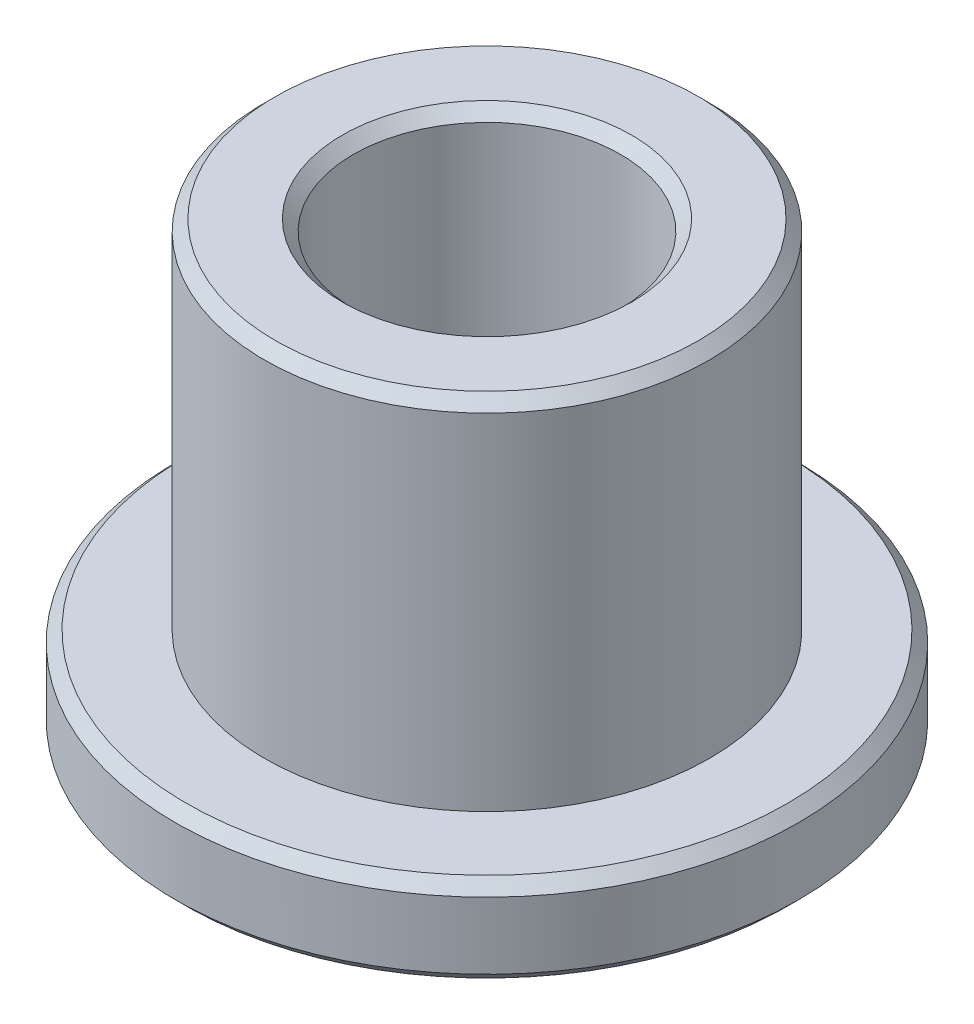
ISO-10303-21;
HEADER;
FILE_DESCRIPTION(('STEP AP214'),'2;1');
FILE_NAME('part.step','',(''),(''),'','','');
FILE_SCHEMA(('AUTOMOTIVE_DESIGN { 1 0 10303 214 1 1 1 1 }'));
ENDSEC;
DATA;
#1=APPLICATION_CONTEXT('core data for automotive mechanical design processes');
#2=APPLICATION_PROTOCOL_DEFINITION('international standard','automotive_design',2000,#1);
#3=PRODUCT_CONTEXT('',#1,'mechanical');
#4=PRODUCT('Part','Part','',(#3));
#5=PRODUCT_RELATED_PRODUCT_CATEGORY('part','',(#4));
#6=PRODUCT_DEFINITION_FORMATION('','',#4);
#7=PRODUCT_DEFINITION_CONTEXT('part definition',#1,'design');
#8=PRODUCT_DEFINITION('design','',#6,#7);
#9=PRODUCT_DEFINITION_SHAPE('','',#8);
#10=(LENGTH_UNIT() NAMED_UNIT(*) SI_UNIT(.MILLI.,.METRE.));
#11=(NAMED_UNIT(*) PLANE_ANGLE_UNIT() SI_UNIT($,.RADIAN.));
#12=(NAMED_UNIT(*) SI_UNIT($,.STERADIAN.) SOLID_ANGLE_UNIT());
#13=UNCERTAINTY_MEASURE_WITH_UNIT(LENGTH_MEASURE(1.E-05),#10,'distance_accuracy_value','');
#14=(GEOMETRIC_REPRESENTATION_CONTEXT(3) GLOBAL_UNCERTAINTY_ASSIGNED_CONTEXT((#13)) GLOBAL_UNIT_ASSIGNED_CONTEXT((#10,
#11,#12)) REPRESENTATION_CONTEXT('',''));
#15=CARTESIAN_POINT('',(0.,0.,0.));
#16=DIRECTION('',(0.,0.,1.));
#17=DIRECTION('',(1.,0.,0.));
#18=AXIS2_PLACEMENT_3D('',#15,#16,#17);
#19=CARTESIAN_POINT('',(-7.,0.,0.));
#20=DIRECTION('',(0.,1.,0.));
#21=DIRECTION('',(-1.,0.,0.));
#22=AXIS2_PLACEMENT_3D('',#19,#20,#21);
#23=PLANE('',#22);
#24=CARTESIAN_POINT('',(0.,0.,0.));
#25=DIRECTION('',(0.,1.,0.));
#26=DIRECTION('',(-1.,0.,0.));
#27=AXIS2_PLACEMENT_3D('',#24,#25,#26);
#28=CIRCLE('',#27,6.75000000000006);
#29=CARTESIAN_POINT('',(-6.75000000000006,0.,0.));
#30=VERTEX_POINT('',#29);
#31=EDGE_CURVE('E63',#30,#30,#28,.F.);
#32=ORIENTED_EDGE('',*,*,#31,.T.);
#33=EDGE_LOOP('',(#32));
#34=FACE_BOUND('',#33,.T.);
#35=CARTESIAN_POINT('',(0.,0.,0.));
#36=DIRECTION('',(0.,-1.,0.));
#37=DIRECTION('',(1.,0.,0.));
#38=AXIS2_PLACEMENT_3D('',#35,#36,#37);
#39=CIRCLE('',#38,3.);
#40=CARTESIAN_POINT('',(3.,0.,0.));
#41=VERTEX_POINT('',#40);
#42=EDGE_CURVE('E66',#41,#41,#39,.T.);
#43=ORIENTED_EDGE('',*,*,#42,.F.);
#44=EDGE_LOOP('',(#43));
#45=FACE_BOUND('',#44,.T.);
#46=ADVANCED_FACE('F33',(#34,#45),#23,.F.);
#47=CARTESIAN_POINT('',(1.22308563454064E-12,-356.558848916779,0.));
#48=DIRECTION('',(0.,-1.,0.));
#49=DIRECTION('',(1.,0.,0.));
#50=AXIS2_PLACEMENT_3D('',#47,#48,#49);
#51=CYLINDRICAL_SURFACE('',#50,2.99999999999998);
#52=CARTESIAN_POINT('',(0.,9.74999999999998,0.));
#53=DIRECTION('',(0.,-1.,0.));
#54=DIRECTION('',(1.,0.,0.));
#55=AXIS2_PLACEMENT_3D('',#52,#53,#54);
#56=CIRCLE('',#55,2.99999999999998);
#57=CARTESIAN_POINT('',(2.99999999999995,9.74999999999999,0.));
#58=VERTEX_POINT('',#57);
#59=EDGE_CURVE('E10',#58,#58,#56,.F.);
#60=ORIENTED_EDGE('',*,*,#59,.T.);
#61=EDGE_LOOP('',(#60));
#62=FACE_BOUND('',#61,.T.);
#63=ORIENTED_EDGE('',*,*,#42,.T.);
#64=EDGE_LOOP('',(#63));
#65=FACE_BOUND('',#64,.T.);
#66=ADVANCED_FACE('F87',(#62,#65),#51,.F.);
#67=CARTESIAN_POINT('',(-3.,10.,0.));
#68=DIRECTION('',(0.,-1.,0.));
#69=DIRECTION('',(1.,0.,0.));
#70=AXIS2_PLACEMENT_3D('',#67,#68,#69);
#71=PLANE('',#70);
#72=CARTESIAN_POINT('',(0.,10.,0.));
#73=DIRECTION('',(0.,-1.,0.));
#74=DIRECTION('',(1.,0.,0.));
#75=AXIS2_PLACEMENT_3D('',#72,#73,#74);
#76=CIRCLE('',#75,4.75);
#77=CARTESIAN_POINT('',(4.74999999999997,10.,0.));
#78=VERTEX_POINT('',#77);
#79=EDGE_CURVE('E41',#78,#78,#76,.F.);
#80=ORIENTED_EDGE('',*,*,#79,.T.);
#81=EDGE_LOOP('',(#80));
#82=FACE_BOUND('',#81,.T.);
#83=CARTESIAN_POINT('',(0.,10.,0.));
#84=DIRECTION('',(0.,-1.,0.));
#85=DIRECTION('',(1.,0.,0.));
#86=AXIS2_PLACEMENT_3D('',#83,#84,#85);
#87=CIRCLE('',#86,3.25);
#88=CARTESIAN_POINT('',(3.24999999999997,10.,0.));
#89=VERTEX_POINT('',#88);
#90=EDGE_CURVE('E45',#89,#89,#87,.T.);
#91=ORIENTED_EDGE('',*,*,#90,.T.);
#92=EDGE_LOOP('',(#91));
#93=FACE_BOUND('',#92,.T.);
#94=ADVANCED_FACE('F77',(#82,#93),#71,.F.);
#95=CARTESIAN_POINT('',(1.22308563454064E-12,-356.558848916779,0.));
#96=DIRECTION('',(0.,-1.,0.));
#97=DIRECTION('',(1.,0.,0.));
#98=AXIS2_PLACEMENT_3D('',#95,#96,#97);
#99=CYLINDRICAL_SURFACE('',#98,4.99999999999998);
#100=CARTESIAN_POINT('',(0.,9.75000000000004,0.));
#101=DIRECTION('',(0.,-1.,0.));
#102=DIRECTION('',(1.,0.,0.));
#103=AXIS2_PLACEMENT_3D('',#100,#101,#102);
#104=CIRCLE('',#103,4.99999999999998);
#105=CARTESIAN_POINT('',(4.99999999999995,9.75000000000005,0.));
#106=VERTEX_POINT('',#105);
#107=EDGE_CURVE('E49',#106,#106,#104,.T.);
#108=ORIENTED_EDGE('',*,*,#107,.T.);
#109=EDGE_LOOP('',(#108));
#110=FACE_BOUND('',#109,.T.);
#111=CARTESIAN_POINT('',(0.,2.,0.));
#112=DIRECTION('',(0.,-1.,0.));
#113=DIRECTION('',(1.,0.,0.));
#114=AXIS2_PLACEMENT_3D('',#111,#112,#113);
#115=CIRCLE('',#114,4.99999999999999);
#116=CARTESIAN_POINT('',(4.99999999999999,2.00000000000002,0.));
#117=VERTEX_POINT('',#116);
#118=EDGE_CURVE('E69',#117,#117,#115,.T.);
#119=ORIENTED_EDGE('',*,*,#118,.F.);
#120=EDGE_LOOP('',(#119));
#121=FACE_BOUND('',#120,.T.);
#122=ADVANCED_FACE('F75',(#110,#121),#99,.T.);
#123=CARTESIAN_POINT('',(-5.,2.,0.));
#124=DIRECTION('',(0.,-1.,0.));
#125=DIRECTION('',(1.,0.,0.));
#126=AXIS2_PLACEMENT_3D('',#123,#124,#125);
#127=PLANE('',#126);
#128=CARTESIAN_POINT('',(0.,2.00000000000002,0.));
#129=DIRECTION('',(0.,-1.,0.));
#130=DIRECTION('',(1.,0.,0.));
#131=AXIS2_PLACEMENT_3D('',#128,#129,#130);
#132=CIRCLE('',#131,6.74999999999996);
#133=CARTESIAN_POINT('',(6.74999999999995,2.00000000000004,0.));
#134=VERTEX_POINT('',#133);
#135=EDGE_CURVE('E54',#134,#134,#132,.F.);
#136=ORIENTED_EDGE('',*,*,#135,.T.);
#137=EDGE_LOOP('',(#136));
#138=FACE_BOUND('',#137,.T.);
#139=ORIENTED_EDGE('',*,*,#118,.T.);
#140=EDGE_LOOP('',(#139));
#141=FACE_BOUND('',#140,.T.);
#142=ADVANCED_FACE('F73',(#138,#141),#127,.F.);
#143=CARTESIAN_POINT('',(1.22308563454064E-12,-356.558848916779,0.));
#144=DIRECTION('',(0.,-1.,0.));
#145=DIRECTION('',(1.,0.,0.));
#146=AXIS2_PLACEMENT_3D('',#143,#144,#145);
#147=CYLINDRICAL_SURFACE('',#146,7.);
#148=CARTESIAN_POINT('',(0.,0.249999999999972,0.));
#149=DIRECTION('',(0.,1.,0.));
#150=DIRECTION('',(-1.,0.,0.));
#151=AXIS2_PLACEMENT_3D('',#148,#149,#150);
#152=CIRCLE('',#151,7.);
#153=CARTESIAN_POINT('',(-7.,0.249999999999948,0.));
#154=VERTEX_POINT('',#153);
#155=EDGE_CURVE('E57',#154,#154,#152,.T.);
#156=ORIENTED_EDGE('',*,*,#155,.T.);
#157=EDGE_LOOP('',(#156));
#158=FACE_BOUND('',#157,.T.);
#159=CARTESIAN_POINT('',(0.,1.74999999999997,0.));
#160=DIRECTION('',(0.,-1.,0.));
#161=DIRECTION('',(1.,0.,0.));
#162=AXIS2_PLACEMENT_3D('',#159,#160,#161);
#163=CIRCLE('',#162,7.);
#164=CARTESIAN_POINT('',(6.99999999999999,1.75,0.));
#165=VERTEX_POINT('',#164);
#166=EDGE_CURVE('E60',#165,#165,#163,.T.);
#167=ORIENTED_EDGE('',*,*,#166,.T.);
#168=EDGE_LOOP('',(#167));
#169=FACE_BOUND('',#168,.T.);
#170=ADVANCED_FACE('F84',(#158,#169),#147,.T.);
#171=CARTESIAN_POINT('',(0.,0.,0.));
#172=DIRECTION('',(0.,1.,0.));
#173=DIRECTION('',(-1.,0.,0.));
#174=AXIS2_PLACEMENT_3D('',#171,#172,#173);
#175=CONICAL_SURFACE('',#174,6.75000000000004,0.785398163397414);
#176=ORIENTED_EDGE('',*,*,#155,.F.);
#177=EDGE_LOOP('',(#176));
#178=FACE_BOUND('',#177,.T.);
#179=ORIENTED_EDGE('',*,*,#31,.F.);
#180=EDGE_LOOP('',(#179));
#181=FACE_BOUND('',#180,.T.);
#182=ADVANCED_FACE('F99',(#178,#181),#175,.T.);
#183=CARTESIAN_POINT('',(0.,1.74999999999997,0.));
#184=DIRECTION('',(0.,-1.,0.));
#185=DIRECTION('',(1.,0.,0.));
#186=AXIS2_PLACEMENT_3D('',#183,#184,#185);
#187=CONICAL_SURFACE('',#186,7.,0.785398163397429);
#188=ORIENTED_EDGE('',*,*,#135,.F.);
#189=EDGE_LOOP('',(#188));
#190=FACE_BOUND('',#189,.T.);
#191=ORIENTED_EDGE('',*,*,#166,.F.);
#192=EDGE_LOOP('',(#191));
#193=FACE_BOUND('',#192,.T.);
#194=ADVANCED_FACE('F105',(#190,#193),#187,.T.);
#195=CARTESIAN_POINT('',(0.,9.75000000000004,0.));
#196=DIRECTION('',(0.,-1.,0.));
#197=DIRECTION('',(1.,0.,0.));
#198=AXIS2_PLACEMENT_3D('',#195,#196,#197);
#199=CONICAL_SURFACE('',#198,4.99999999999998,0.785398163397445);
#200=ORIENTED_EDGE('',*,*,#79,.F.);
#201=EDGE_LOOP('',(#200));
#202=FACE_BOUND('',#201,.T.);
#203=ORIENTED_EDGE('',*,*,#107,.F.);
#204=EDGE_LOOP('',(#203));
#205=FACE_BOUND('',#204,.T.);
#206=ADVANCED_FACE('F111',(#202,#205),#199,.T.);
#207=CARTESIAN_POINT('',(0.,10.,0.));
#208=DIRECTION('',(0.,1.,0.));
#209=DIRECTION('',(-1.,0.,0.));
#210=AXIS2_PLACEMENT_3D('',#207,#208,#209);
#211=CONICAL_SURFACE('',#210,3.25,0.785398163397424);
#212=ORIENTED_EDGE('',*,*,#59,.F.);
#213=EDGE_LOOP('',(#212));
#214=FACE_BOUND('',#213,.T.);
#215=ORIENTED_EDGE('',*,*,#90,.F.);
#216=EDGE_LOOP('',(#215));
#217=FACE_BOUND('',#216,.T.);
#218=ADVANCED_FACE('F36',(#214,#217),#211,.F.);
#219=CLOSED_SHELL('',(#46,#66,#94,#122,#142,#170,#182,#194,#206,#218));
#220=MANIFOLD_SOLID_BREP('B2',#219);
#221=ADVANCED_BREP_SHAPE_REPRESENTATION('',(#18,#220),#14);
#222=SHAPE_DEFINITION_REPRESENTATION(#9,#221);
ENDSEC;
END-ISO-10303-21;
